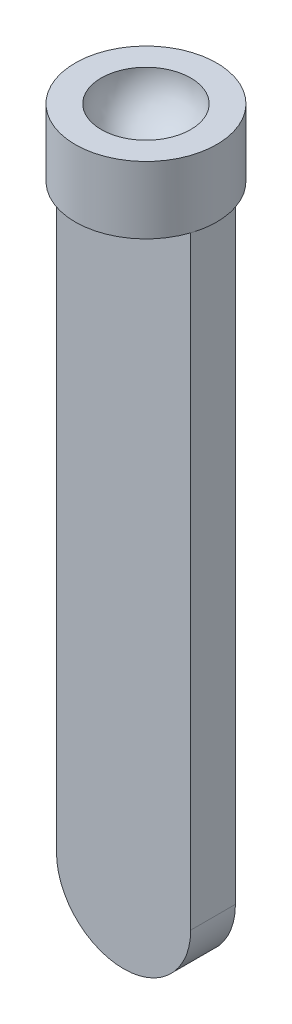
ISO-10303-21;
HEADER;
FILE_DESCRIPTION(('STEP AP214'),'2;1');
FILE_NAME('part.step','',(''),(''),'','','');
FILE_SCHEMA(('AUTOMOTIVE_DESIGN { 1 0 10303 214 1 1 1 1 }'));
ENDSEC;
DATA;
#1=APPLICATION_CONTEXT('core data for automotive mechanical design processes');
#2=APPLICATION_PROTOCOL_DEFINITION('international standard','automotive_design',2000,#1);
#3=PRODUCT_CONTEXT('',#1,'mechanical');
#4=PRODUCT('Part','Part','',(#3));
#5=PRODUCT_RELATED_PRODUCT_CATEGORY('part','',(#4));
#6=PRODUCT_DEFINITION_FORMATION('','',#4);
#7=PRODUCT_DEFINITION_CONTEXT('part definition',#1,'design');
#8=PRODUCT_DEFINITION('design','',#6,#7);
#9=PRODUCT_DEFINITION_SHAPE('','',#8);
#10=(LENGTH_UNIT() NAMED_UNIT(*) SI_UNIT(.MILLI.,.METRE.));
#11=(NAMED_UNIT(*) PLANE_ANGLE_UNIT() SI_UNIT($,.RADIAN.));
#12=(NAMED_UNIT(*) SI_UNIT($,.STERADIAN.) SOLID_ANGLE_UNIT());
#13=UNCERTAINTY_MEASURE_WITH_UNIT(LENGTH_MEASURE(1.E-05),#10,'distance_accuracy_value','');
#14=(GEOMETRIC_REPRESENTATION_CONTEXT(3) GLOBAL_UNCERTAINTY_ASSIGNED_CONTEXT((#13)) GLOBAL_UNIT_ASSIGNED_CONTEXT((#10,
#11,#12)) REPRESENTATION_CONTEXT('',''));
#15=CARTESIAN_POINT('',(0.,0.,0.));
#16=DIRECTION('',(0.,0.,1.));
#17=DIRECTION('',(1.,0.,0.));
#18=AXIS2_PLACEMENT_3D('',#15,#16,#17);
#19=CARTESIAN_POINT('',(15.,-75.,5.));
#20=DIRECTION('',(-1.,0.,0.));
#21=DIRECTION('',(0.,0.,1.));
#22=AXIS2_PLACEMENT_3D('',#19,#20,#21);
#23=PLANE('',#22);
#24=DIRECTION('',(0.,0.,-1.));
#25=VECTOR('',#24,1.);
#26=CARTESIAN_POINT('',(15.,60.,5.));
#27=LINE('',#26,#25);
#28=CARTESIAN_POINT('',(15.,60.,5.));
#29=VERTEX_POINT('',#28);
#30=CARTESIAN_POINT('',(15.,60.,-5.));
#31=VERTEX_POINT('',#30);
#32=EDGE_CURVE('E68',#29,#31,#27,.T.);
#33=ORIENTED_EDGE('',*,*,#32,.F.);
#34=DIRECTION('',(0.,1.,0.));
#35=VECTOR('',#34,1.);
#36=CARTESIAN_POINT('',(15.,-75.,5.));
#37=LINE('',#36,#35);
#38=CARTESIAN_POINT('',(15.,-75.,5.));
#39=VERTEX_POINT('',#38);
#40=EDGE_CURVE('E137',#39,#29,#37,.T.);
#41=ORIENTED_EDGE('',*,*,#40,.F.);
#42=DIRECTION('',(0.,0.,-1.));
#43=VECTOR('',#42,1.);
#44=CARTESIAN_POINT('',(15.,-75.,5.));
#45=LINE('',#44,#43);
#46=CARTESIAN_POINT('',(15.,-75.,-5.));
#47=VERTEX_POINT('',#46);
#48=EDGE_CURVE('E145',#39,#47,#45,.T.);
#49=ORIENTED_EDGE('',*,*,#48,.T.);
#50=DIRECTION('',(0.,1.,0.));
#51=VECTOR('',#50,1.);
#52=CARTESIAN_POINT('',(15.,-75.,-5.));
#53=LINE('',#52,#51);
#54=EDGE_CURVE('E96',#47,#31,#53,.T.);
#55=ORIENTED_EDGE('',*,*,#54,.T.);
#56=EDGE_LOOP('',(#33,#41,#49,#55));
#57=FACE_BOUND('',#56,.T.);
#58=ADVANCED_FACE('F45',(#57),#23,.F.);
#59=CARTESIAN_POINT('',(-15.,-75.,5.));
#60=DIRECTION('',(1.,0.,0.));
#61=DIRECTION('',(0.,0.,-1.));
#62=AXIS2_PLACEMENT_3D('',#59,#60,#61);
#63=PLANE('',#62);
#64=DIRECTION('',(0.,0.,1.));
#65=VECTOR('',#64,1.);
#66=CARTESIAN_POINT('',(-15.,60.,5.));
#67=LINE('',#66,#65);
#68=CARTESIAN_POINT('',(-15.,60.,-5.));
#69=VERTEX_POINT('',#68);
#70=CARTESIAN_POINT('',(-15.,60.,5.));
#71=VERTEX_POINT('',#70);
#72=EDGE_CURVE('E99',#69,#71,#67,.T.);
#73=ORIENTED_EDGE('',*,*,#72,.F.);
#74=DIRECTION('',(0.,-1.,0.));
#75=VECTOR('',#74,1.);
#76=CARTESIAN_POINT('',(-15.,-75.,-5.));
#77=LINE('',#76,#75);
#78=CARTESIAN_POINT('',(-15.,-75.,-5.));
#79=VERTEX_POINT('',#78);
#80=EDGE_CURVE('E87',#69,#79,#77,.T.);
#81=ORIENTED_EDGE('',*,*,#80,.T.);
#82=DIRECTION('',(0.,0.,-1.));
#83=VECTOR('',#82,1.);
#84=CARTESIAN_POINT('',(-15.,-75.,5.));
#85=LINE('',#84,#83);
#86=CARTESIAN_POINT('',(-15.,-75.,5.));
#87=VERTEX_POINT('',#86);
#88=EDGE_CURVE('E53',#87,#79,#85,.T.);
#89=ORIENTED_EDGE('',*,*,#88,.F.);
#90=DIRECTION('',(0.,-1.,0.));
#91=VECTOR('',#90,1.);
#92=CARTESIAN_POINT('',(-15.,-75.,5.));
#93=LINE('',#92,#91);
#94=EDGE_CURVE('E101',#71,#87,#93,.T.);
#95=ORIENTED_EDGE('',*,*,#94,.F.);
#96=EDGE_LOOP('',(#73,#81,#89,#95));
#97=FACE_BOUND('',#96,.T.);
#98=ADVANCED_FACE('F100',(#97),#63,.F.);
#99=CARTESIAN_POINT('',(0.,-75.,5.));
#100=DIRECTION('',(0.,0.,1.));
#101=DIRECTION('',(1.,0.,0.));
#102=AXIS2_PLACEMENT_3D('',#99,#100,#101);
#103=PLANE('',#102);
#104=ORIENTED_EDGE('',*,*,#40,.T.);
#105=DIRECTION('',(-1.,0.,0.));
#106=VECTOR('',#105,1.);
#107=CARTESIAN_POINT('',(0.,60.,5.));
#108=LINE('',#107,#106);
#109=EDGE_CURVE('E60',#29,#71,#108,.T.);
#110=ORIENTED_EDGE('',*,*,#109,.T.);
#111=ORIENTED_EDGE('',*,*,#94,.T.);
#112=CARTESIAN_POINT('',(0.,-75.,5.));
#113=DIRECTION('',(0.,0.,1.));
#114=DIRECTION('',(1.,0.,0.));
#115=AXIS2_PLACEMENT_3D('',#112,#113,#114);
#116=CIRCLE('',#115,15.);
#117=EDGE_CURVE('E142',#87,#39,#116,.T.);
#118=ORIENTED_EDGE('',*,*,#117,.T.);
#119=EDGE_LOOP('',(#104,#110,#111,#118));
#120=FACE_BOUND('',#119,.T.);
#121=ADVANCED_FACE('F157',(#120),#103,.T.);
#122=CARTESIAN_POINT('',(0.,-75.,-5.));
#123=DIRECTION('',(0.,0.,1.));
#124=DIRECTION('',(1.,0.,0.));
#125=AXIS2_PLACEMENT_3D('',#122,#123,#124);
#126=PLANE('',#125);
#127=DIRECTION('',(-1.,0.,0.));
#128=VECTOR('',#127,1.);
#129=CARTESIAN_POINT('',(0.,60.,-5.));
#130=LINE('',#129,#128);
#131=EDGE_CURVE('E11',#31,#69,#130,.T.);
#132=ORIENTED_EDGE('',*,*,#131,.F.);
#133=ORIENTED_EDGE('',*,*,#54,.F.);
#134=CARTESIAN_POINT('',(0.,-75.,-5.));
#135=DIRECTION('',(0.,0.,1.));
#136=DIRECTION('',(1.,0.,0.));
#137=AXIS2_PLACEMENT_3D('',#134,#135,#136);
#138=CIRCLE('',#137,15.);
#139=EDGE_CURVE('E91',#79,#47,#138,.T.);
#140=ORIENTED_EDGE('',*,*,#139,.F.);
#141=ORIENTED_EDGE('',*,*,#80,.F.);
#142=EDGE_LOOP('',(#132,#133,#140,#141));
#143=FACE_BOUND('',#142,.T.);
#144=ADVANCED_FACE('F89',(#143),#126,.F.);
#145=CARTESIAN_POINT('',(0.,-75.,5.));
#146=DIRECTION('',(0.,0.,-1.));
#147=DIRECTION('',(-1.,0.,0.));
#148=AXIS2_PLACEMENT_3D('',#145,#146,#147);
#149=CYLINDRICAL_SURFACE('',#148,15.);
#150=ORIENTED_EDGE('',*,*,#139,.T.);
#151=ORIENTED_EDGE('',*,*,#48,.F.);
#152=ORIENTED_EDGE('',*,*,#117,.F.);
#153=ORIENTED_EDGE('',*,*,#88,.T.);
#154=EDGE_LOOP('',(#150,#151,#152,#153));
#155=FACE_BOUND('',#154,.T.);
#156=ADVANCED_FACE('F155',(#155),#149,.T.);
#157=CARTESIAN_POINT('',(0.,60.,0.));
#158=DIRECTION('',(0.,1.,0.));
#159=DIRECTION('',(0.,0.,1.));
#160=AXIS2_PLACEMENT_3D('',#157,#158,#159);
#161=CYLINDRICAL_SURFACE('',#160,15.8113883008419);
#162=CARTESIAN_POINT('',(0.,75.,0.));
#163=DIRECTION('',(0.,1.,0.));
#164=DIRECTION('',(0.,0.,1.));
#165=AXIS2_PLACEMENT_3D('',#162,#163,#164);
#166=CIRCLE('',#165,15.8113883008419);
#167=CARTESIAN_POINT('',(0.,75.,15.8113883008419));
#168=VERTEX_POINT('',#167);
#169=EDGE_CURVE('E129',#168,#168,#166,.T.);
#170=ORIENTED_EDGE('',*,*,#169,.F.);
#171=EDGE_LOOP('',(#170));
#172=FACE_BOUND('',#171,.T.);
#173=CARTESIAN_POINT('',(0.,60.,0.));
#174=DIRECTION('',(0.,1.,0.));
#175=DIRECTION('',(0.,0.,1.));
#176=AXIS2_PLACEMENT_3D('',#173,#174,#175);
#177=CIRCLE('',#176,15.8113883008419);
#178=EDGE_CURVE('E120',#71,#29,#177,.T.);
#179=ORIENTED_EDGE('',*,*,#178,.T.);
#180=EDGE_CURVE('E106',#29,#31,#177,.T.);
#181=ORIENTED_EDGE('',*,*,#180,.T.);
#182=EDGE_CURVE('E112',#31,#69,#177,.T.);
#183=ORIENTED_EDGE('',*,*,#182,.T.);
#184=EDGE_CURVE('E115',#69,#71,#177,.T.);
#185=ORIENTED_EDGE('',*,*,#184,.T.);
#186=EDGE_LOOP('',(#179,#181,#183,#185));
#187=FACE_BOUND('',#186,.T.);
#188=ADVANCED_FACE('F122',(#172,#187),#161,.T.);
#189=CARTESIAN_POINT('',(0.,60.,0.));
#190=DIRECTION('',(0.,1.,0.));
#191=DIRECTION('',(0.,0.,1.));
#192=AXIS2_PLACEMENT_3D('',#189,#190,#191);
#193=PLANE('',#192);
#194=ORIENTED_EDGE('',*,*,#180,.F.);
#195=ORIENTED_EDGE('',*,*,#32,.T.);
#196=EDGE_LOOP('',(#194,#195));
#197=FACE_BOUND('',#196,.T.);
#198=ADVANCED_FACE('F162',(#197),#193,.F.);
#199=ORIENTED_EDGE('',*,*,#184,.F.);
#200=ORIENTED_EDGE('',*,*,#72,.T.);
#201=EDGE_LOOP('',(#199,#200));
#202=FACE_BOUND('',#201,.T.);
#203=ADVANCED_FACE('F116',(#202),#193,.F.);
#204=ORIENTED_EDGE('',*,*,#182,.F.);
#205=ORIENTED_EDGE('',*,*,#131,.T.);
#206=EDGE_LOOP('',(#204,#205));
#207=FACE_BOUND('',#206,.T.);
#208=ADVANCED_FACE('F110',(#207),#193,.F.);
#209=ORIENTED_EDGE('',*,*,#109,.F.);
#210=ORIENTED_EDGE('',*,*,#178,.F.);
#211=EDGE_LOOP('',(#209,#210));
#212=FACE_BOUND('',#211,.T.);
#213=ADVANCED_FACE('F159',(#212),#193,.F.);
#214=CARTESIAN_POINT('',(-15.,75.,5.));
#215=DIRECTION('',(0.,-1.,0.));
#216=DIRECTION('',(0.,0.,-1.));
#217=AXIS2_PLACEMENT_3D('',#214,#215,#216);
#218=PLANE('',#217);
#219=CARTESIAN_POINT('',(0.,75.,0.));
#220=DIRECTION('',(0.,1.,0.));
#221=DIRECTION('',(-1.,0.,0.));
#222=AXIS2_PLACEMENT_3D('',#219,#220,#221);
#223=CIRCLE('',#222,10.);
#224=CARTESIAN_POINT('',(-10.,75.,0.));
#225=VERTEX_POINT('',#224);
#226=EDGE_CURVE('E128',#225,#225,#223,.T.);
#227=ORIENTED_EDGE('',*,*,#226,.F.);
#228=EDGE_LOOP('',(#227));
#229=FACE_BOUND('',#228,.T.);
#230=ORIENTED_EDGE('',*,*,#169,.T.);
#231=EDGE_LOOP('',(#230));
#232=FACE_BOUND('',#231,.T.);
#233=ADVANCED_FACE('F173',(#229,#232),#218,.F.);
#234=CARTESIAN_POINT('',(0.,75.,0.));
#235=DIRECTION('',(0.,1.,0.));
#236=DIRECTION('',(1.,0.,0.));
#237=AXIS2_PLACEMENT_3D('',#234,#235,#236);
#238=SPHERICAL_SURFACE('',#237,10.);
#239=ORIENTED_EDGE('',*,*,#226,.T.);
#240=EDGE_LOOP('',(#239));
#241=FACE_BOUND('',#240,.T.);
#242=ADVANCED_FACE('F187',(#241),#238,.F.);
#243=CLOSED_SHELL('',(#58,#98,#121,#144,#156,#188,#198,#203,#208,#213,#233,#242));
#244=MANIFOLD_SOLID_BREP('B2',#243);
#245=ADVANCED_BREP_SHAPE_REPRESENTATION('',(#18,#244),#14);
#246=SHAPE_DEFINITION_REPRESENTATION(#9,#245);
ENDSEC;
END-ISO-10303-21;
